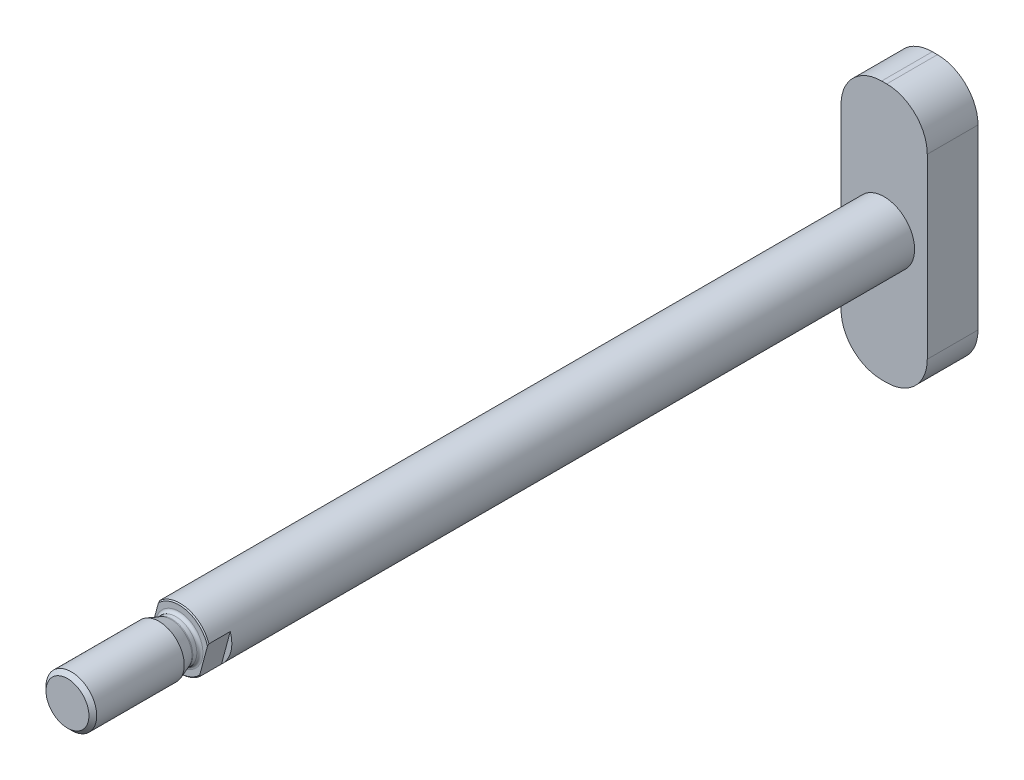
ISO-10303-21;
HEADER;
FILE_DESCRIPTION(('STEP AP214'),'2;1');
FILE_NAME('part.step','',(''),(''),'','','');
FILE_SCHEMA(('AUTOMOTIVE_DESIGN { 1 0 10303 214 1 1 1 1 }'));
ENDSEC;
DATA;
#1=APPLICATION_CONTEXT('core data for automotive mechanical design processes');
#2=APPLICATION_PROTOCOL_DEFINITION('international standard','automotive_design',2000,#1);
#3=PRODUCT_CONTEXT('',#1,'mechanical');
#4=PRODUCT('Part','Part','',(#3));
#5=PRODUCT_RELATED_PRODUCT_CATEGORY('part','',(#4));
#6=PRODUCT_DEFINITION_FORMATION('','',#4);
#7=PRODUCT_DEFINITION_CONTEXT('part definition',#1,'design');
#8=PRODUCT_DEFINITION('design','',#6,#7);
#9=PRODUCT_DEFINITION_SHAPE('','',#8);
#10=(LENGTH_UNIT() NAMED_UNIT(*) SI_UNIT(.MILLI.,.METRE.));
#11=(NAMED_UNIT(*) PLANE_ANGLE_UNIT() SI_UNIT($,.RADIAN.));
#12=(NAMED_UNIT(*) SI_UNIT($,.STERADIAN.) SOLID_ANGLE_UNIT());
#13=UNCERTAINTY_MEASURE_WITH_UNIT(LENGTH_MEASURE(1.E-05),#10,'distance_accuracy_value','');
#14=(GEOMETRIC_REPRESENTATION_CONTEXT(3) GLOBAL_UNCERTAINTY_ASSIGNED_CONTEXT((#13)) GLOBAL_UNIT_ASSIGNED_CONTEXT((#10,
#11,#12)) REPRESENTATION_CONTEXT('',''));
#15=CARTESIAN_POINT('',(0.,0.,0.));
#16=DIRECTION('',(0.,0.,1.));
#17=DIRECTION('',(1.,0.,0.));
#18=AXIS2_PLACEMENT_3D('',#15,#16,#17);
#19=CARTESIAN_POINT('',(0.,4.7,8.));
#20=DIRECTION('',(0.,0.,-1.));
#21=DIRECTION('',(-1.,0.,0.));
#22=AXIS2_PLACEMENT_3D('',#19,#20,#21);
#23=PLANE('',#22);
#24=CARTESIAN_POINT('',(0.,0.,8.));
#25=DIRECTION('',(0.,0.,-1.));
#26=DIRECTION('',(-0.701527519997691,0.712642363802412,0.));
#27=AXIS2_PLACEMENT_3D('',#24,#25,#26);
#28=CIRCLE('',#27,5.8);
#29=CARTESIAN_POINT('',(-4.06885961598661,4.13332571005399,8.));
#30=VERTEX_POINT('',#29);
#31=CARTESIAN_POINT('',(5.59039864690412,1.54513525902934,8.));
#32=VERTEX_POINT('',#31);
#33=EDGE_CURVE('E133',#30,#32,#28,.T.);
#34=ORIENTED_EDGE('',*,*,#33,.F.);
#35=DIRECTION('',(0.25881904510252,0.965925826289069,0.));
#36=VECTOR('',#35,1.);
#37=CARTESIAN_POINT('',(-5.59039864690412,-1.54513525902932,8.));
#38=LINE('',#37,#36);
#39=CARTESIAN_POINT('',(-5.59039864690413,-1.54513525902932,8.));
#40=VERTEX_POINT('',#39);
#41=EDGE_CURVE('E118',#40,#30,#38,.T.);
#42=ORIENTED_EDGE('',*,*,#41,.F.);
#43=CARTESIAN_POINT('',(0.,0.,8.));
#44=DIRECTION('',(0.,0.,-1.));
#45=DIRECTION('',(0.701527519997682,-0.712642363802421,0.));
#46=AXIS2_PLACEMENT_3D('',#43,#44,#45);
#47=CIRCLE('',#46,5.8);
#48=CARTESIAN_POINT('',(4.06885961598656,-4.13332571005404,8.));
#49=VERTEX_POINT('',#48);
#50=EDGE_CURVE('E132',#49,#40,#47,.T.);
#51=ORIENTED_EDGE('',*,*,#50,.F.);
#52=DIRECTION('',(-0.258819045102524,-0.965925826289067,0.));
#53=VECTOR('',#52,1.);
#54=CARTESIAN_POINT('',(5.59039864690411,1.54513525902934,8.));
#55=LINE('',#54,#53);
#56=EDGE_CURVE('E149',#32,#49,#55,.T.);
#57=ORIENTED_EDGE('',*,*,#56,.F.);
#58=EDGE_LOOP('',(#34,#42,#51,#57));
#59=FACE_BOUND('',#58,.T.);
#60=CARTESIAN_POINT('',(0.,0.,8.));
#61=DIRECTION('',(0.,0.,-1.));
#62=DIRECTION('',(-1.,0.,0.));
#63=AXIS2_PLACEMENT_3D('',#60,#61,#62);
#64=CIRCLE('',#63,4.7000000000001);
#65=CARTESIAN_POINT('',(-4.7000000000001,0.,8.));
#66=VERTEX_POINT('',#65);
#67=EDGE_CURVE('E144',#66,#66,#64,.T.);
#68=ORIENTED_EDGE('',*,*,#67,.T.);
#69=EDGE_LOOP('',(#68));
#70=FACE_BOUND('',#69,.T.);
#71=ADVANCED_FACE('F17',(#59,#70),#23,.F.);
#72=CARTESIAN_POINT('',(0.,0.,8.));
#73=DIRECTION('',(0.,0.,-1.));
#74=DIRECTION('',(-1.,0.,0.));
#75=AXIS2_PLACEMENT_3D('',#72,#73,#74);
#76=CONICAL_SURFACE('',#75,5.8,0.785398163397435);
#77=CARTESIAN_POINT('',(-4.06885961363799,4.13332571881914,7.9999999954012));
#78=CARTESIAN_POINT('',(-4.05242983268217,4.19464249610349,7.96782900571077));
#79=CARTESIAN_POINT('',(-4.0360828009047,4.25565044924995,7.93504605587608));
#80=CARTESIAN_POINT('',(-4.00353888798448,4.37710598574534,7.8683442376697));
#81=CARTESIAN_POINT('',(-3.98734463379041,4.43754376518829,7.83443065189444));
#82=CARTESIAN_POINT('',(-3.97122347024358,4.49770876662216,7.80000000000305));
#83=B_SPLINE_CURVE_WITH_KNOTS('',3,(#77,#78,#79,#80,#81,#82),.UNSPECIFIED.,.F.,.F.,(4,2,4),
(6.54939197142929,6.76083639674133,6.97228082205337),.UNSPECIFIED.);
#84=CARTESIAN_POINT('',(-3.97122347024215,4.4977087666275,7.8));
#85=VERTEX_POINT('',#84);
#86=EDGE_CURVE('E122',#30,#85,#83,.T.);
#87=ORIENTED_EDGE('',*,*,#86,.F.);
#88=ORIENTED_EDGE('',*,*,#33,.T.);
#89=CARTESIAN_POINT('',(5.68803479244502,1.90951831484316,7.80000000043446));
#90=CARTESIAN_POINT('',(5.67189802600862,1.84929508263264,7.83446397607243));
#91=CARTESIAN_POINT('',(5.65567227321811,1.78873974882741,7.86844217320521));
#92=CARTESIAN_POINT('',(5.62312807417169,1.66728314449456,7.9351417814255));
#93=CARTESIAN_POINT('',(5.60681255443408,1.60639279588189,7.96786009062861));
#94=CARTESIAN_POINT('',(5.59039868992768,1.54513541959546,7.99999991575573));
#95=B_SPLINE_CURVE_WITH_KNOTS('',3,(#89,#90,#91,#92,#93,#94),.UNSPECIFIED.,.F.,.F.,(4,2,4),
(0.00143435453377375,0.213523717826306,0.425613081118838),.UNSPECIFIED.);
#96=CARTESIAN_POINT('',(5.68803479264844,1.90951831560234,7.8));
#97=VERTEX_POINT('',#96);
#98=EDGE_CURVE('E143',#97,#32,#95,.T.);
#99=ORIENTED_EDGE('',*,*,#98,.F.);
#100=CARTESIAN_POINT('',(0.,0.,7.80000000000001));
#101=DIRECTION('',(0.,0.,-1.));
#102=DIRECTION('',(-0.661870578373692,0.749618127771251,0.));
#103=AXIS2_PLACEMENT_3D('',#100,#101,#102);
#104=CIRCLE('',#103,6.);
#105=EDGE_CURVE('E141',#85,#97,#104,.T.);
#106=ORIENTED_EDGE('',*,*,#105,.F.);
#107=EDGE_LOOP('',(#87,#88,#99,#106));
#108=FACE_BOUND('',#107,.T.);
#109=ADVANCED_FACE('F139',(#108),#76,.T.);
#110=CARTESIAN_POINT('',(-7.4178195824705,-8.3651630373781,8.6));
#111=DIRECTION('',(-0.965925826289069,0.25881904510252,0.));
#112=DIRECTION('',(-0.25881904510252,-0.965925826289069,0.));
#113=AXIS2_PLACEMENT_3D('',#110,#111,#112);
#114=PLANE('',#113);
#115=DIRECTION('',(0.,0.,-1.));
#116=VECTOR('',#115,1.);
#117=CARTESIAN_POINT('',(-3.97122347024215,4.4977087666275,7.80000000000001));
#118=LINE('',#117,#116);
#119=CARTESIAN_POINT('',(-3.97122347024215,4.4977087666275,3.6));
#120=VERTEX_POINT('',#119);
#121=EDGE_CURVE('E418',#85,#120,#118,.T.);
#122=ORIENTED_EDGE('',*,*,#121,.T.);
#123=DIRECTION('',(0.25881904510252,0.965925826289069,0.));
#124=VECTOR('',#123,1.);
#125=CARTESIAN_POINT('',(-5.68803479264845,-1.90951831560233,3.6));
#126=LINE('',#125,#124);
#127=CARTESIAN_POINT('',(-5.68803479264845,-1.90951831560233,3.6));
#128=VERTEX_POINT('',#127);
#129=EDGE_CURVE('E413',#128,#120,#126,.T.);
#130=ORIENTED_EDGE('',*,*,#129,.F.);
#131=DIRECTION('',(0.,0.,1.));
#132=VECTOR('',#131,1.);
#133=CARTESIAN_POINT('',(-5.68803479264845,-1.90951831560233,3.59999999999999));
#134=LINE('',#133,#132);
#135=CARTESIAN_POINT('',(-5.68803479264845,-1.90951831560233,7.8));
#136=VERTEX_POINT('',#135);
#137=EDGE_CURVE('E410',#128,#136,#134,.T.);
#138=ORIENTED_EDGE('',*,*,#137,.T.);
#139=CARTESIAN_POINT('',(-5.68803479244502,-1.90951831484313,7.80000000043446));
#140=CARTESIAN_POINT('',(-5.67189802600862,-1.84929508263262,7.83446397607243));
#141=CARTESIAN_POINT('',(-5.65567227321811,-1.78873974882739,7.86844217320521));
#142=CARTESIAN_POINT('',(-5.6231280741717,-1.66728314449454,7.9351417814255));
#143=CARTESIAN_POINT('',(-5.60681255443409,-1.60639279588187,7.96786009062861));
#144=CARTESIAN_POINT('',(-5.59039868992769,-1.54513541959544,7.99999991575573));
#145=B_SPLINE_CURVE_WITH_KNOTS('',3,(#139,#140,#141,#142,#143,#144),.UNSPECIFIED.,.F.,.F.,(4,2,
4),(0.00143435453377136,0.213523717826302,0.425613081118834),.UNSPECIFIED.);
#146=EDGE_CURVE('E126',#136,#40,#145,.T.);
#147=ORIENTED_EDGE('',*,*,#146,.T.);
#148=ORIENTED_EDGE('',*,*,#41,.T.);
#149=ORIENTED_EDGE('',*,*,#86,.T.);
#150=EDGE_LOOP('',(#122,#130,#138,#147,#148,#149));
#151=FACE_BOUND('',#150,.T.);
#152=ADVANCED_FACE('F121',(#151),#114,.T.);
#153=CARTESIAN_POINT('',(4.06885961363794,-4.13332571881919,7.9999999954012));
#154=CARTESIAN_POINT('',(4.05242983268212,-4.19464249610354,7.96782900571077));
#155=CARTESIAN_POINT('',(4.03608280090465,-4.25565044925001,7.93504605587608));
#156=CARTESIAN_POINT('',(4.00353888798442,-4.37710598574539,7.8683442376697));
#157=CARTESIAN_POINT('',(3.98734463379035,-4.43754376518833,7.83443065189444));
#158=CARTESIAN_POINT('',(3.97122347024353,-4.4977087666222,7.80000000000306));
#159=B_SPLINE_CURVE_WITH_KNOTS('',3,(#153,#154,#155,#156,#157,#158),.UNSPECIFIED.,.F.,.F.,(4,2,
4),(6.54939197142939,6.76083639674143,6.97228082205347),.UNSPECIFIED.);
#160=CARTESIAN_POINT('',(3.9712234702421,-4.49770876662755,7.8));
#161=VERTEX_POINT('',#160);
#162=EDGE_CURVE('E409',#49,#161,#159,.T.);
#163=ORIENTED_EDGE('',*,*,#162,.F.);
#164=ORIENTED_EDGE('',*,*,#50,.T.);
#165=ORIENTED_EDGE('',*,*,#146,.F.);
#166=CARTESIAN_POINT('',(0.,0.,7.80000000000001));
#167=DIRECTION('',(0.,0.,-1.));
#168=DIRECTION('',(0.661870578373683,-0.749618127771258,0.));
#169=AXIS2_PLACEMENT_3D('',#166,#167,#168);
#170=CIRCLE('',#169,6.);
#171=EDGE_CURVE('E406',#161,#136,#170,.T.);
#172=ORIENTED_EDGE('',*,*,#171,.F.);
#173=EDGE_LOOP('',(#163,#164,#165,#172));
#174=FACE_BOUND('',#173,.T.);
#175=ADVANCED_FACE('F377',(#174),#76,.T.);
#176=CARTESIAN_POINT('',(6.7707719697142,5.9503484716554,8.6));
#177=DIRECTION('',(0.965925826289067,-0.258819045102524,0.));
#178=DIRECTION('',(0.258819045102524,0.965925826289067,0.));
#179=AXIS2_PLACEMENT_3D('',#176,#177,#178);
#180=PLANE('',#179);
#181=DIRECTION('',(0.,0.,-1.));
#182=VECTOR('',#181,1.);
#183=CARTESIAN_POINT('',(3.9712234702421,-4.49770876662755,7.80000000000001));
#184=LINE('',#183,#182);
#185=CARTESIAN_POINT('',(3.9712234702421,-4.49770876662755,3.6));
#186=VERTEX_POINT('',#185);
#187=EDGE_CURVE('E778',#161,#186,#184,.T.);
#188=ORIENTED_EDGE('',*,*,#187,.T.);
#189=DIRECTION('',(-0.258819045102524,-0.965925826289067,0.));
#190=VECTOR('',#189,1.);
#191=CARTESIAN_POINT('',(5.68803479264844,1.90951831560234,3.6));
#192=LINE('',#191,#190);
#193=CARTESIAN_POINT('',(5.68803479264844,1.90951831560234,3.6));
#194=VERTEX_POINT('',#193);
#195=EDGE_CURVE('E189',#194,#186,#192,.T.);
#196=ORIENTED_EDGE('',*,*,#195,.F.);
#197=DIRECTION('',(0.,0.,1.));
#198=VECTOR('',#197,1.);
#199=CARTESIAN_POINT('',(5.68803479264844,1.90951831560234,3.59999999999999));
#200=LINE('',#199,#198);
#201=EDGE_CURVE('E181',#194,#97,#200,.T.);
#202=ORIENTED_EDGE('',*,*,#201,.T.);
#203=ORIENTED_EDGE('',*,*,#98,.T.);
#204=ORIENTED_EDGE('',*,*,#56,.T.);
#205=ORIENTED_EDGE('',*,*,#162,.T.);
#206=EDGE_LOOP('',(#188,#196,#202,#203,#204,#205));
#207=FACE_BOUND('',#206,.T.);
#208=ADVANCED_FACE('F173',(#207),#180,.T.);
#209=CARTESIAN_POINT('',(0.,0.,8.6000000000001));
#210=DIRECTION('',(0.,0.,-1.));
#211=DIRECTION('',(-1.,0.,0.));
#212=AXIS2_PLACEMENT_3D('',#209,#210,#211);
#213=TOROIDAL_SURFACE('',#212,4.7000000000001,0.6000000000001);
#214=ORIENTED_EDGE('',*,*,#67,.F.);
#215=EDGE_LOOP('',(#214));
#216=FACE_BOUND('',#215,.T.);
#217=CARTESIAN_POINT('',(0.,0.,8.6));
#218=DIRECTION('',(0.,0.,-1.));
#219=DIRECTION('',(-1.,0.,0.));
#220=AXIS2_PLACEMENT_3D('',#217,#218,#219);
#221=CIRCLE('',#220,4.1);
#222=CARTESIAN_POINT('',(-4.1,0.,8.6));
#223=VERTEX_POINT('',#222);
#224=EDGE_CURVE('E177',#223,#223,#221,.T.);
#225=ORIENTED_EDGE('',*,*,#224,.T.);
#226=EDGE_LOOP('',(#225));
#227=FACE_BOUND('',#226,.T.);
#228=ADVANCED_FACE('F169',(#216,#227),#213,.F.);
#229=CARTESIAN_POINT('',(0.,0.,-141.));
#230=DIRECTION('',(0.,0.,-1.));
#231=DIRECTION('',(-1.,0.,0.));
#232=AXIS2_PLACEMENT_3D('',#229,#230,#231);
#233=CYLINDRICAL_SURFACE('',#232,6.);
#234=CARTESIAN_POINT('',(0.,0.,-131.));
#235=DIRECTION('',(0.,0.,1.));
#236=DIRECTION('',(1.,0.,0.));
#237=AXIS2_PLACEMENT_3D('',#234,#235,#236);
#238=CIRCLE('',#237,6.);
#239=CARTESIAN_POINT('',(6.,0.,-131.));
#240=VERTEX_POINT('',#239);
#241=EDGE_CURVE('E180',#240,#240,#238,.T.);
#242=ORIENTED_EDGE('',*,*,#241,.T.);
#243=EDGE_LOOP('',(#242));
#244=FACE_BOUND('',#243,.T.);
#245=ORIENTED_EDGE('',*,*,#121,.F.);
#246=ORIENTED_EDGE('',*,*,#105,.T.);
#247=ORIENTED_EDGE('',*,*,#201,.F.);
#248=CARTESIAN_POINT('',(0.,0.,3.59999999999999));
#249=DIRECTION('',(0.,0.,1.));
#250=DIRECTION('',(0.661870578373683,-0.749618127771258,0.));
#251=AXIS2_PLACEMENT_3D('',#248,#249,#250);
#252=CIRCLE('',#251,6.);
#253=EDGE_CURVE('E186',#186,#194,#252,.T.);
#254=ORIENTED_EDGE('',*,*,#253,.F.);
#255=ORIENTED_EDGE('',*,*,#187,.F.);
#256=ORIENTED_EDGE('',*,*,#171,.T.);
#257=ORIENTED_EDGE('',*,*,#137,.F.);
#258=CARTESIAN_POINT('',(0.,0.,3.59999999999999));
#259=DIRECTION('',(0.,0.,1.));
#260=DIRECTION('',(-0.661870578373692,0.749618127771251,0.));
#261=AXIS2_PLACEMENT_3D('',#258,#259,#260);
#262=CIRCLE('',#261,6.);
#263=EDGE_CURVE('E199',#120,#128,#262,.T.);
#264=ORIENTED_EDGE('',*,*,#263,.F.);
#265=EDGE_LOOP('',(#245,#246,#247,#254,#255,#256,#257,#264));
#266=FACE_BOUND('',#265,.T.);
#267=ADVANCED_FACE('F172',(#244,#266),#233,.T.);
#268=CARTESIAN_POINT('',(0.,0.,3.6));
#269=DIRECTION('',(0.,0.,1.));
#270=DIRECTION('',(1.,0.,0.));
#271=AXIS2_PLACEMENT_3D('',#268,#269,#270);
#272=PLANE('',#271);
#273=ORIENTED_EDGE('',*,*,#263,.T.);
#274=ORIENTED_EDGE('',*,*,#129,.T.);
#275=EDGE_LOOP('',(#273,#274));
#276=FACE_BOUND('',#275,.T.);
#277=ADVANCED_FACE('F478',(#276),#272,.T.);
#278=ORIENTED_EDGE('',*,*,#253,.T.);
#279=ORIENTED_EDGE('',*,*,#195,.T.);
#280=EDGE_LOOP('',(#278,#279));
#281=FACE_BOUND('',#280,.T.);
#282=ADVANCED_FACE('F482',(#281),#272,.T.);
#283=CARTESIAN_POINT('',(0.,0.,7.5));
#284=DIRECTION('',(0.,0.,-1.));
#285=DIRECTION('',(-1.,0.,0.));
#286=AXIS2_PLACEMENT_3D('',#283,#284,#285);
#287=CYLINDRICAL_SURFACE('',#286,4.1);
#288=ORIENTED_EDGE('',*,*,#224,.F.);
#289=EDGE_LOOP('',(#288));
#290=FACE_BOUND('',#289,.T.);
#291=CARTESIAN_POINT('',(0.,0.,9.3942038115749));
#292=DIRECTION('',(0.,0.,-1.));
#293=DIRECTION('',(-1.,0.,0.));
#294=AXIS2_PLACEMENT_3D('',#291,#292,#293);
#295=CIRCLE('',#294,4.1);
#296=CARTESIAN_POINT('',(-4.1,0.,9.3942038115749));
#297=VERTEX_POINT('',#296);
#298=EDGE_CURVE('E204',#297,#297,#295,.T.);
#299=ORIENTED_EDGE('',*,*,#298,.T.);
#300=EDGE_LOOP('',(#299));
#301=FACE_BOUND('',#300,.T.);
#302=ADVANCED_FACE('F484',(#290,#301),#287,.T.);
#303=CARTESIAN_POINT('',(-0.499999999999383,-17.4999999999994,-131.));
#304=DIRECTION('',(0.,0.,1.));
#305=DIRECTION('',(1.,0.,0.));
#306=AXIS2_PLACEMENT_3D('',#303,#304,#305);
#307=PLANE('',#306);
#308=ORIENTED_EDGE('',*,*,#241,.F.);
#309=EDGE_LOOP('',(#308));
#310=FACE_BOUND('',#309,.T.);
#311=DIRECTION('',(0.,-1.,0.));
#312=VECTOR('',#311,1.);
#313=CARTESIAN_POINT('',(-8.5,17.5,-131.));
#314=LINE('',#313,#312);
#315=CARTESIAN_POINT('',(-8.5,17.5,-131.));
#316=VERTEX_POINT('',#315);
#317=CARTESIAN_POINT('',(-8.5,-17.5,-131.));
#318=VERTEX_POINT('',#317);
#319=EDGE_CURVE('E210',#316,#318,#314,.T.);
#320=ORIENTED_EDGE('',*,*,#319,.T.);
#321=CARTESIAN_POINT('',(-0.499999999999383,-17.4999999999994,-131.));
#322=DIRECTION('',(0.,0.,1.));
#323=DIRECTION('',(-1.,0.,0.));
#324=AXIS2_PLACEMENT_3D('',#321,#322,#323);
#325=CIRCLE('',#324,8.00000000000062);
#326=CARTESIAN_POINT('',(-0.5,-25.5,-131.));
#327=VERTEX_POINT('',#326);
#328=EDGE_CURVE('E214',#318,#327,#325,.T.);
#329=ORIENTED_EDGE('',*,*,#328,.T.);
#330=DIRECTION('',(1.,0.,0.));
#331=VECTOR('',#330,1.);
#332=CARTESIAN_POINT('',(-0.5,-25.5,-131.));
#333=LINE('',#332,#331);
#334=CARTESIAN_POINT('',(0.5,-25.5,-131.));
#335=VERTEX_POINT('',#334);
#336=EDGE_CURVE('E220',#327,#335,#333,.T.);
#337=ORIENTED_EDGE('',*,*,#336,.T.);
#338=CARTESIAN_POINT('',(0.499999999999384,-17.4999999999994,-131.));
#339=DIRECTION('',(0.,0.,1.));
#340=DIRECTION('',(0.,-1.,0.));
#341=AXIS2_PLACEMENT_3D('',#338,#339,#340);
#342=CIRCLE('',#341,8.00000000000061);
#343=CARTESIAN_POINT('',(8.5,-17.5,-131.));
#344=VERTEX_POINT('',#343);
#345=EDGE_CURVE('E226',#335,#344,#342,.T.);
#346=ORIENTED_EDGE('',*,*,#345,.T.);
#347=DIRECTION('',(0.,1.,0.));
#348=VECTOR('',#347,1.);
#349=CARTESIAN_POINT('',(8.5,-17.5,-131.));
#350=LINE('',#349,#348);
#351=CARTESIAN_POINT('',(8.5,17.5,-131.));
#352=VERTEX_POINT('',#351);
#353=EDGE_CURVE('E232',#344,#352,#350,.T.);
#354=ORIENTED_EDGE('',*,*,#353,.T.);
#355=CARTESIAN_POINT('',(0.499999999999383,17.4999999999994,-131.));
#356=DIRECTION('',(0.,0.,1.));
#357=DIRECTION('',(1.,0.,0.));
#358=AXIS2_PLACEMENT_3D('',#355,#356,#357);
#359=CIRCLE('',#358,8.00000000000062);
#360=CARTESIAN_POINT('',(0.5,25.5,-131.));
#361=VERTEX_POINT('',#360);
#362=EDGE_CURVE('E238',#352,#361,#359,.T.);
#363=ORIENTED_EDGE('',*,*,#362,.T.);
#364=DIRECTION('',(-1.,0.,0.));
#365=VECTOR('',#364,1.);
#366=CARTESIAN_POINT('',(0.5,25.5,-131.));
#367=LINE('',#366,#365);
#368=CARTESIAN_POINT('',(-0.5,25.5,-131.));
#369=VERTEX_POINT('',#368);
#370=EDGE_CURVE('E244',#361,#369,#367,.T.);
#371=ORIENTED_EDGE('',*,*,#370,.T.);
#372=CARTESIAN_POINT('',(-0.499999999999384,17.4999999999994,-131.));
#373=DIRECTION('',(0.,0.,1.));
#374=DIRECTION('',(0.,1.,0.));
#375=AXIS2_PLACEMENT_3D('',#372,#373,#374);
#376=CIRCLE('',#375,8.00000000000061);
#377=EDGE_CURVE('E250',#369,#316,#376,.T.);
#378=ORIENTED_EDGE('',*,*,#377,.T.);
#379=EDGE_LOOP('',(#320,#329,#337,#346,#354,#363,#371,#378));
#380=FACE_BOUND('',#379,.T.);
#381=ADVANCED_FACE('F487',(#310,#380),#307,.T.);
#382=CARTESIAN_POINT('',(0.,0.,9.39420381157483));
#383=DIRECTION('',(0.,0.,-1.));
#384=DIRECTION('',(-1.,0.,0.));
#385=AXIS2_PLACEMENT_3D('',#382,#383,#384);
#386=TOROIDAL_SURFACE('',#385,4.69999999999969,0.599999999999684);
#387=ORIENTED_EDGE('',*,*,#298,.F.);
#388=EDGE_LOOP('',(#387));
#389=FACE_BOUND('',#388,.T.);
#390=CARTESIAN_POINT('',(0.,0.,9.5994158975703));
#391=DIRECTION('',(0.,0.,-1.));
#392=DIRECTION('',(-1.,0.,0.));
#393=AXIS2_PLACEMENT_3D('',#390,#391,#392);
#394=CIRCLE('',#393,4.1361844275285);
#395=CARTESIAN_POINT('',(-4.1361844275285,0.,9.5994158975703));
#396=VERTEX_POINT('',#395);
#397=EDGE_CURVE('E256',#396,#396,#394,.T.);
#398=ORIENTED_EDGE('',*,*,#397,.T.);
#399=EDGE_LOOP('',(#398));
#400=FACE_BOUND('',#399,.T.);
#401=ADVANCED_FACE('F490',(#389,#400),#386,.F.);
#402=CARTESIAN_POINT('',(-8.5,17.5,-131.));
#403=DIRECTION('',(1.,0.,0.));
#404=DIRECTION('',(0.,0.,-1.));
#405=AXIS2_PLACEMENT_3D('',#402,#403,#404);
#406=PLANE('',#405);
#407=DIRECTION('',(0.,-1.,0.));
#408=VECTOR('',#407,1.);
#409=CARTESIAN_POINT('',(-8.5,17.5,-141.));
#410=LINE('',#409,#408);
#411=CARTESIAN_POINT('',(-8.5,17.5,-141.));
#412=VERTEX_POINT('',#411);
#413=CARTESIAN_POINT('',(-8.5,-17.5,-141.));
#414=VERTEX_POINT('',#413);
#415=EDGE_CURVE('E262',#412,#414,#410,.T.);
#416=ORIENTED_EDGE('',*,*,#415,.T.);
#417=DIRECTION('',(0.,0.,-1.));
#418=VECTOR('',#417,1.);
#419=CARTESIAN_POINT('',(-8.5,-17.5,-131.));
#420=LINE('',#419,#418);
#421=EDGE_CURVE('E266',#318,#414,#420,.T.);
#422=ORIENTED_EDGE('',*,*,#421,.F.);
#423=ORIENTED_EDGE('',*,*,#319,.F.);
#424=DIRECTION('',(0.,0.,-1.));
#425=VECTOR('',#424,1.);
#426=CARTESIAN_POINT('',(-8.5,17.5,-131.));
#427=LINE('',#426,#425);
#428=EDGE_CURVE('E272',#316,#412,#427,.T.);
#429=ORIENTED_EDGE('',*,*,#428,.T.);
#430=EDGE_LOOP('',(#416,#422,#423,#429));
#431=FACE_BOUND('',#430,.T.);
#432=ADVANCED_FACE('F494',(#431),#406,.F.);
#433=CARTESIAN_POINT('',(-0.499999999999383,-17.4999999999994,-131.));
#434=DIRECTION('',(0.,0.,-1.));
#435=DIRECTION('',(-1.,0.,0.));
#436=AXIS2_PLACEMENT_3D('',#433,#434,#435);
#437=CYLINDRICAL_SURFACE('',#436,8.00000000000062);
#438=CARTESIAN_POINT('',(-0.499999999999383,-17.4999999999994,-141.));
#439=DIRECTION('',(0.,0.,1.));
#440=DIRECTION('',(-1.,0.,0.));
#441=AXIS2_PLACEMENT_3D('',#438,#439,#440);
#442=CIRCLE('',#441,8.00000000000062);
#443=CARTESIAN_POINT('',(-0.5,-25.5,-141.));
#444=VERTEX_POINT('',#443);
#445=EDGE_CURVE('E278',#414,#444,#442,.T.);
#446=ORIENTED_EDGE('',*,*,#445,.T.);
#447=DIRECTION('',(0.,0.,-1.));
#448=VECTOR('',#447,1.);
#449=CARTESIAN_POINT('',(-0.5,-25.5,-131.));
#450=LINE('',#449,#448);
#451=EDGE_CURVE('E284',#327,#444,#450,.T.);
#452=ORIENTED_EDGE('',*,*,#451,.F.);
#453=ORIENTED_EDGE('',*,*,#328,.F.);
#454=ORIENTED_EDGE('',*,*,#421,.T.);
#455=EDGE_LOOP('',(#446,#452,#453,#454));
#456=FACE_BOUND('',#455,.T.);
#457=ADVANCED_FACE('F498',(#456),#437,.T.);
#458=CARTESIAN_POINT('',(-0.5,-25.5,-131.));
#459=DIRECTION('',(0.,1.,0.));
#460=DIRECTION('',(0.,0.,1.));
#461=AXIS2_PLACEMENT_3D('',#458,#459,#460);
#462=PLANE('',#461);
#463=DIRECTION('',(1.,0.,0.));
#464=VECTOR('',#463,1.);
#465=CARTESIAN_POINT('',(-0.5,-25.5,-141.));
#466=LINE('',#465,#464);
#467=CARTESIAN_POINT('',(0.5,-25.5,-141.));
#468=VERTEX_POINT('',#467);
#469=EDGE_CURVE('E290',#444,#468,#466,.T.);
#470=ORIENTED_EDGE('',*,*,#469,.T.);
#471=DIRECTION('',(0.,0.,-1.));
#472=VECTOR('',#471,1.);
#473=CARTESIAN_POINT('',(0.5,-25.5,-131.));
#474=LINE('',#473,#472);
#475=EDGE_CURVE('E296',#335,#468,#474,.T.);
#476=ORIENTED_EDGE('',*,*,#475,.F.);
#477=ORIENTED_EDGE('',*,*,#336,.F.);
#478=ORIENTED_EDGE('',*,*,#451,.T.);
#479=EDGE_LOOP('',(#470,#476,#477,#478));
#480=FACE_BOUND('',#479,.T.);
#481=ADVANCED_FACE('F502',(#480),#462,.F.);
#482=CARTESIAN_POINT('',(0.499999999999384,-17.4999999999994,-131.));
#483=DIRECTION('',(0.,0.,-1.));
#484=DIRECTION('',(-1.,0.,0.));
#485=AXIS2_PLACEMENT_3D('',#482,#483,#484);
#486=CYLINDRICAL_SURFACE('',#485,8.00000000000061);
#487=CARTESIAN_POINT('',(0.499999999999384,-17.4999999999994,-141.));
#488=DIRECTION('',(0.,0.,1.));
#489=DIRECTION('',(0.,-1.,0.));
#490=AXIS2_PLACEMENT_3D('',#487,#488,#489);
#491=CIRCLE('',#490,8.00000000000061);
#492=CARTESIAN_POINT('',(8.5,-17.5,-141.));
#493=VERTEX_POINT('',#492);
#494=EDGE_CURVE('E302',#468,#493,#491,.T.);
#495=ORIENTED_EDGE('',*,*,#494,.T.);
#496=DIRECTION('',(0.,0.,-1.));
#497=VECTOR('',#496,1.);
#498=CARTESIAN_POINT('',(8.5,-17.5,-131.));
#499=LINE('',#498,#497);
#500=EDGE_CURVE('E308',#344,#493,#499,.T.);
#501=ORIENTED_EDGE('',*,*,#500,.F.);
#502=ORIENTED_EDGE('',*,*,#345,.F.);
#503=ORIENTED_EDGE('',*,*,#475,.T.);
#504=EDGE_LOOP('',(#495,#501,#502,#503));
#505=FACE_BOUND('',#504,.T.);
#506=ADVANCED_FACE('F506',(#505),#486,.T.);
#507=CARTESIAN_POINT('',(8.5,-17.5,-131.));
#508=DIRECTION('',(-1.,0.,0.));
#509=DIRECTION('',(0.,0.,1.));
#510=AXIS2_PLACEMENT_3D('',#507,#508,#509);
#511=PLANE('',#510);
#512=DIRECTION('',(0.,1.,0.));
#513=VECTOR('',#512,1.);
#514=CARTESIAN_POINT('',(8.5,-17.5,-141.));
#515=LINE('',#514,#513);
#516=CARTESIAN_POINT('',(8.5,17.5,-141.));
#517=VERTEX_POINT('',#516);
#518=EDGE_CURVE('E314',#493,#517,#515,.T.);
#519=ORIENTED_EDGE('',*,*,#518,.T.);
#520=DIRECTION('',(0.,0.,-1.));
#521=VECTOR('',#520,1.);
#522=CARTESIAN_POINT('',(8.5,17.5,-131.));
#523=LINE('',#522,#521);
#524=EDGE_CURVE('E320',#352,#517,#523,.T.);
#525=ORIENTED_EDGE('',*,*,#524,.F.);
#526=ORIENTED_EDGE('',*,*,#353,.F.);
#527=ORIENTED_EDGE('',*,*,#500,.T.);
#528=EDGE_LOOP('',(#519,#525,#526,#527));
#529=FACE_BOUND('',#528,.T.);
#530=ADVANCED_FACE('F510',(#529),#511,.F.);
#531=CARTESIAN_POINT('',(0.499999999999383,17.4999999999994,-131.));
#532=DIRECTION('',(0.,0.,-1.));
#533=DIRECTION('',(-1.,0.,0.));
#534=AXIS2_PLACEMENT_3D('',#531,#532,#533);
#535=CYLINDRICAL_SURFACE('',#534,8.00000000000062);
#536=CARTESIAN_POINT('',(0.499999999999383,17.4999999999994,-141.));
#537=DIRECTION('',(0.,0.,1.));
#538=DIRECTION('',(1.,0.,0.));
#539=AXIS2_PLACEMENT_3D('',#536,#537,#538);
#540=CIRCLE('',#539,8.00000000000062);
#541=CARTESIAN_POINT('',(0.5,25.5,-141.));
#542=VERTEX_POINT('',#541);
#543=EDGE_CURVE('E326',#517,#542,#540,.T.);
#544=ORIENTED_EDGE('',*,*,#543,.T.);
#545=DIRECTION('',(0.,0.,-1.));
#546=VECTOR('',#545,1.);
#547=CARTESIAN_POINT('',(0.5,25.5,-131.));
#548=LINE('',#547,#546);
#549=EDGE_CURVE('E331',#361,#542,#548,.T.);
#550=ORIENTED_EDGE('',*,*,#549,.F.);
#551=ORIENTED_EDGE('',*,*,#362,.F.);
#552=ORIENTED_EDGE('',*,*,#524,.T.);
#553=EDGE_LOOP('',(#544,#550,#551,#552));
#554=FACE_BOUND('',#553,.T.);
#555=ADVANCED_FACE('F514',(#554),#535,.T.);
#556=CARTESIAN_POINT('',(0.5,25.5,-131.));
#557=DIRECTION('',(0.,-1.,0.));
#558=DIRECTION('',(0.,0.,-1.));
#559=AXIS2_PLACEMENT_3D('',#556,#557,#558);
#560=PLANE('',#559);
#561=DIRECTION('',(-1.,0.,0.));
#562=VECTOR('',#561,1.);
#563=CARTESIAN_POINT('',(0.5,25.5,-141.));
#564=LINE('',#563,#562);
#565=CARTESIAN_POINT('',(-0.5,25.5,-141.));
#566=VERTEX_POINT('',#565);
#567=EDGE_CURVE('E37',#542,#566,#564,.T.);
#568=ORIENTED_EDGE('',*,*,#567,.T.);
#569=DIRECTION('',(0.,0.,-1.));
#570=VECTOR('',#569,1.);
#571=CARTESIAN_POINT('',(-0.5,25.5,-131.));
#572=LINE('',#571,#570);
#573=EDGE_CURVE('E341',#369,#566,#572,.T.);
#574=ORIENTED_EDGE('',*,*,#573,.F.);
#575=ORIENTED_EDGE('',*,*,#370,.F.);
#576=ORIENTED_EDGE('',*,*,#549,.T.);
#577=EDGE_LOOP('',(#568,#574,#575,#576));
#578=FACE_BOUND('',#577,.T.);
#579=ADVANCED_FACE('F518',(#578),#560,.F.);
#580=CARTESIAN_POINT('',(-0.499999999999384,17.4999999999994,-131.));
#581=DIRECTION('',(0.,0.,-1.));
#582=DIRECTION('',(-1.,0.,0.));
#583=AXIS2_PLACEMENT_3D('',#580,#581,#582);
#584=CYLINDRICAL_SURFACE('',#583,8.00000000000061);
#585=CARTESIAN_POINT('',(-0.499999999999384,17.4999999999994,-141.));
#586=DIRECTION('',(0.,0.,1.));
#587=DIRECTION('',(0.,1.,0.));
#588=AXIS2_PLACEMENT_3D('',#585,#586,#587);
#589=CIRCLE('',#588,8.00000000000061);
#590=EDGE_CURVE('E33',#566,#412,#589,.T.);
#591=ORIENTED_EDGE('',*,*,#590,.T.);
#592=ORIENTED_EDGE('',*,*,#428,.F.);
#593=ORIENTED_EDGE('',*,*,#377,.F.);
#594=ORIENTED_EDGE('',*,*,#573,.T.);
#595=EDGE_LOOP('',(#591,#592,#593,#594));
#596=FACE_BOUND('',#595,.T.);
#597=ADVANCED_FACE('F522',(#596),#584,.T.);
#598=CARTESIAN_POINT('',(0.,0.,11.972729677509));
#599=DIRECTION('',(0.,0.,1.));
#600=DIRECTION('',(1.,0.,0.));
#601=AXIS2_PLACEMENT_3D('',#598,#599,#600);
#602=CONICAL_SURFACE('',#601,5.,0.349065850398867);
#603=ORIENTED_EDGE('',*,*,#397,.F.);
#604=EDGE_LOOP('',(#603));
#605=FACE_BOUND('',#604,.T.);
#606=CARTESIAN_POINT('',(0.,0.,11.972729677509));
#607=DIRECTION('',(0.,0.,-1.));
#608=DIRECTION('',(-1.,0.,0.));
#609=AXIS2_PLACEMENT_3D('',#606,#607,#608);
#610=CIRCLE('',#609,5.);
#611=CARTESIAN_POINT('',(-5.,0.,11.972729677509));
#612=VERTEX_POINT('',#611);
#613=EDGE_CURVE('E351',#612,#612,#610,.T.);
#614=ORIENTED_EDGE('',*,*,#613,.T.);
#615=EDGE_LOOP('',(#614));
#616=FACE_BOUND('',#615,.T.);
#617=ADVANCED_FACE('F526',(#605,#616),#602,.T.);
#618=CARTESIAN_POINT('',(0.,6.,-141.));
#619=DIRECTION('',(0.,0.,1.));
#620=DIRECTION('',(1.,0.,0.));
#621=AXIS2_PLACEMENT_3D('',#618,#619,#620);
#622=PLANE('',#621);
#623=ORIENTED_EDGE('',*,*,#415,.F.);
#624=ORIENTED_EDGE('',*,*,#590,.F.);
#625=ORIENTED_EDGE('',*,*,#567,.F.);
#626=ORIENTED_EDGE('',*,*,#543,.F.);
#627=ORIENTED_EDGE('',*,*,#518,.F.);
#628=ORIENTED_EDGE('',*,*,#494,.F.);
#629=ORIENTED_EDGE('',*,*,#469,.F.);
#630=ORIENTED_EDGE('',*,*,#445,.F.);
#631=EDGE_LOOP('',(#623,#624,#625,#626,#627,#628,#629,#630));
#632=FACE_BOUND('',#631,.T.);
#633=ADVANCED_FACE('F530',(#632),#622,.F.);
#634=CARTESIAN_POINT('',(0.,0.,7.5));
#635=DIRECTION('',(0.,0.,-1.));
#636=DIRECTION('',(-1.,0.,0.));
#637=AXIS2_PLACEMENT_3D('',#634,#635,#636);
#638=CYLINDRICAL_SURFACE('',#637,5.);
#639=ORIENTED_EDGE('',*,*,#613,.F.);
#640=EDGE_LOOP('',(#639));
#641=FACE_BOUND('',#640,.T.);
#642=CARTESIAN_POINT('',(0.,0.,29.233));
#643=DIRECTION('',(0.,0.,-1.));
#644=DIRECTION('',(-1.,0.,0.));
#645=AXIS2_PLACEMENT_3D('',#642,#643,#644);
#646=CIRCLE('',#645,5.);
#647=CARTESIAN_POINT('',(-5.,0.,29.233));
#648=VERTEX_POINT('',#647);
#649=EDGE_CURVE('E26',#648,#648,#646,.T.);
#650=ORIENTED_EDGE('',*,*,#649,.T.);
#651=EDGE_LOOP('',(#650));
#652=FACE_BOUND('',#651,.T.);
#653=ADVANCED_FACE('F360',(#641,#652),#638,.T.);
#654=CARTESIAN_POINT('',(0.,0.,30.));
#655=DIRECTION('',(0.,0.,-1.));
#656=DIRECTION('',(-1.,0.,0.));
#657=AXIS2_PLACEMENT_3D('',#654,#655,#656);
#658=CONICAL_SURFACE('',#657,4.233,0.78539816339745);
#659=ORIENTED_EDGE('',*,*,#649,.F.);
#660=EDGE_LOOP('',(#659));
#661=FACE_BOUND('',#660,.T.);
#662=CARTESIAN_POINT('',(0.,0.,30.));
#663=DIRECTION('',(0.,0.,-1.));
#664=DIRECTION('',(-1.,0.,0.));
#665=AXIS2_PLACEMENT_3D('',#662,#663,#664);
#666=CIRCLE('',#665,4.233);
#667=CARTESIAN_POINT('',(-4.233,0.,30.));
#668=VERTEX_POINT('',#667);
#669=EDGE_CURVE('E11',#668,#668,#666,.T.);
#670=ORIENTED_EDGE('',*,*,#669,.T.);
#671=EDGE_LOOP('',(#670));
#672=FACE_BOUND('',#671,.T.);
#673=ADVANCED_FACE('F362',(#661,#672),#658,.T.);
#674=CARTESIAN_POINT('',(0.,0.,30.));
#675=DIRECTION('',(0.,0.,-1.));
#676=DIRECTION('',(-1.,0.,0.));
#677=AXIS2_PLACEMENT_3D('',#674,#675,#676);
#678=PLANE('',#677);
#679=ORIENTED_EDGE('',*,*,#669,.F.);
#680=EDGE_LOOP('',(#679));
#681=FACE_BOUND('',#680,.T.);
#682=ADVANCED_FACE('F19',(#681),#678,.F.);
#683=CLOSED_SHELL('',(#71,#109,#152,#175,#208,#228,#267,#277,#282,#302,#381,#401,#432,#457,#481,
#506,#530,#555,#579,#597,#617,#633,#653,#673,#682));
#684=MANIFOLD_SOLID_BREP('B1',#683);
#685=ADVANCED_BREP_SHAPE_REPRESENTATION('',(#18,#684),#14);
#686=SHAPE_DEFINITION_REPRESENTATION(#9,#685);
ENDSEC;
END-ISO-10303-21;
